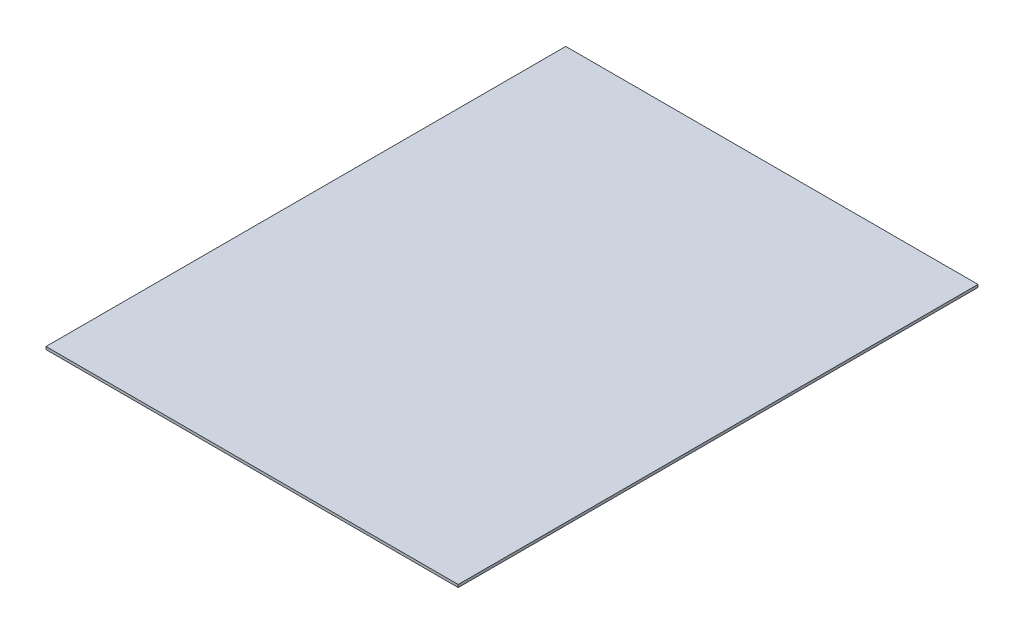
ISO-10303-21;
HEADER;
FILE_DESCRIPTION(('STEP AP214'),'2;1');
FILE_NAME('part.step','',(''),(''),'','','');
FILE_SCHEMA(('AUTOMOTIVE_DESIGN { 1 0 10303 214 1 1 1 1 }'));
ENDSEC;
DATA;
#1=APPLICATION_CONTEXT('core data for automotive mechanical design processes');
#2=APPLICATION_PROTOCOL_DEFINITION('international standard','automotive_design',2000,#1);
#3=PRODUCT_CONTEXT('',#1,'mechanical');
#4=PRODUCT('Part','Part','',(#3));
#5=PRODUCT_RELATED_PRODUCT_CATEGORY('part','',(#4));
#6=PRODUCT_DEFINITION_FORMATION('','',#4);
#7=PRODUCT_DEFINITION_CONTEXT('part definition',#1,'design');
#8=PRODUCT_DEFINITION('design','',#6,#7);
#9=PRODUCT_DEFINITION_SHAPE('','',#8);
#10=(LENGTH_UNIT() NAMED_UNIT(*) SI_UNIT(.MILLI.,.METRE.));
#11=(NAMED_UNIT(*) PLANE_ANGLE_UNIT() SI_UNIT($,.RADIAN.));
#12=(NAMED_UNIT(*) SI_UNIT($,.STERADIAN.) SOLID_ANGLE_UNIT());
#13=UNCERTAINTY_MEASURE_WITH_UNIT(LENGTH_MEASURE(1.E-05),#10,'distance_accuracy_value','');
#14=(GEOMETRIC_REPRESENTATION_CONTEXT(3) GLOBAL_UNCERTAINTY_ASSIGNED_CONTEXT((#13)) GLOBAL_UNIT_ASSIGNED_CONTEXT((#10,
#11,#12)) REPRESENTATION_CONTEXT('',''));
#15=CARTESIAN_POINT('',(0.,0.,0.));
#16=DIRECTION('',(0.,0.,1.));
#17=DIRECTION('',(1.,0.,0.));
#18=AXIS2_PLACEMENT_3D('',#15,#16,#17);
#19=CARTESIAN_POINT('',(230.,3.,-290.));
#20=DIRECTION('',(-1.,0.,0.));
#21=DIRECTION('',(0.,0.,1.));
#22=AXIS2_PLACEMENT_3D('',#19,#20,#21);
#23=PLANE('',#22);
#24=DIRECTION('',(0.,0.,-1.));
#25=VECTOR('',#24,1.);
#26=CARTESIAN_POINT('',(230.,0.,-290.));
#27=LINE('',#26,#25);
#28=CARTESIAN_POINT('',(230.,0.,290.));
#29=VERTEX_POINT('',#28);
#30=CARTESIAN_POINT('',(230.,0.,-290.));
#31=VERTEX_POINT('',#30);
#32=EDGE_CURVE('E102',#29,#31,#27,.T.);
#33=ORIENTED_EDGE('',*,*,#32,.T.);
#34=DIRECTION('',(0.,-1.,0.));
#35=VECTOR('',#34,1.);
#36=CARTESIAN_POINT('',(230.,3.,-290.));
#37=LINE('',#36,#35);
#38=CARTESIAN_POINT('',(230.,3.,-290.));
#39=VERTEX_POINT('',#38);
#40=EDGE_CURVE('E11',#39,#31,#37,.T.);
#41=ORIENTED_EDGE('',*,*,#40,.F.);
#42=DIRECTION('',(0.,0.,-1.));
#43=VECTOR('',#42,1.);
#44=CARTESIAN_POINT('',(230.,3.,-290.));
#45=LINE('',#44,#43);
#46=CARTESIAN_POINT('',(230.,3.,290.));
#47=VERTEX_POINT('',#46);
#48=EDGE_CURVE('E90',#47,#39,#45,.T.);
#49=ORIENTED_EDGE('',*,*,#48,.F.);
#50=DIRECTION('',(0.,-1.,0.));
#51=VECTOR('',#50,1.);
#52=CARTESIAN_POINT('',(230.,3.,290.));
#53=LINE('',#52,#51);
#54=EDGE_CURVE('E98',#47,#29,#53,.T.);
#55=ORIENTED_EDGE('',*,*,#54,.T.);
#56=EDGE_LOOP('',(#33,#41,#49,#55));
#57=FACE_BOUND('',#56,.T.);
#58=ADVANCED_FACE('F39',(#57),#23,.F.);
#59=CARTESIAN_POINT('',(-230.,3.,-290.));
#60=DIRECTION('',(0.,0.,1.));
#61=DIRECTION('',(1.,0.,0.));
#62=AXIS2_PLACEMENT_3D('',#59,#60,#61);
#63=PLANE('',#62);
#64=DIRECTION('',(-1.,0.,0.));
#65=VECTOR('',#64,1.);
#66=CARTESIAN_POINT('',(-230.,0.,-290.));
#67=LINE('',#66,#65);
#68=CARTESIAN_POINT('',(-230.,0.,-290.));
#69=VERTEX_POINT('',#68);
#70=EDGE_CURVE('E94',#31,#69,#67,.T.);
#71=ORIENTED_EDGE('',*,*,#70,.T.);
#72=DIRECTION('',(0.,-1.,0.));
#73=VECTOR('',#72,1.);
#74=CARTESIAN_POINT('',(-230.,3.,-290.));
#75=LINE('',#74,#73);
#76=CARTESIAN_POINT('',(-230.,3.,-290.));
#77=VERTEX_POINT('',#76);
#78=EDGE_CURVE('E47',#77,#69,#75,.T.);
#79=ORIENTED_EDGE('',*,*,#78,.F.);
#80=DIRECTION('',(-1.,0.,0.));
#81=VECTOR('',#80,1.);
#82=CARTESIAN_POINT('',(-230.,3.,-290.));
#83=LINE('',#82,#81);
#84=EDGE_CURVE('E85',#39,#77,#83,.T.);
#85=ORIENTED_EDGE('',*,*,#84,.F.);
#86=ORIENTED_EDGE('',*,*,#40,.T.);
#87=EDGE_LOOP('',(#71,#79,#85,#86));
#88=FACE_BOUND('',#87,.T.);
#89=ADVANCED_FACE('F93',(#88),#63,.F.);
#90=CARTESIAN_POINT('',(-230.,3.,-290.));
#91=DIRECTION('',(1.,0.,0.));
#92=DIRECTION('',(0.,0.,-1.));
#93=AXIS2_PLACEMENT_3D('',#90,#91,#92);
#94=PLANE('',#93);
#95=DIRECTION('',(0.,0.,1.));
#96=VECTOR('',#95,1.);
#97=CARTESIAN_POINT('',(-230.,0.,-290.));
#98=LINE('',#97,#96);
#99=CARTESIAN_POINT('',(-230.,0.,290.));
#100=VERTEX_POINT('',#99);
#101=EDGE_CURVE('E72',#69,#100,#98,.T.);
#102=ORIENTED_EDGE('',*,*,#101,.T.);
#103=DIRECTION('',(0.,-1.,0.));
#104=VECTOR('',#103,1.);
#105=CARTESIAN_POINT('',(-230.,3.,290.));
#106=LINE('',#105,#104);
#107=CARTESIAN_POINT('',(-230.,3.,290.));
#108=VERTEX_POINT('',#107);
#109=EDGE_CURVE('E95',#108,#100,#106,.T.);
#110=ORIENTED_EDGE('',*,*,#109,.F.);
#111=DIRECTION('',(0.,0.,1.));
#112=VECTOR('',#111,1.);
#113=CARTESIAN_POINT('',(-230.,3.,-290.));
#114=LINE('',#113,#112);
#115=EDGE_CURVE('E88',#77,#108,#114,.T.);
#116=ORIENTED_EDGE('',*,*,#115,.F.);
#117=ORIENTED_EDGE('',*,*,#78,.T.);
#118=EDGE_LOOP('',(#102,#110,#116,#117));
#119=FACE_BOUND('',#118,.T.);
#120=ADVANCED_FACE('F96',(#119),#94,.F.);
#121=CARTESIAN_POINT('',(-230.,3.,290.));
#122=DIRECTION('',(0.,0.,-1.));
#123=DIRECTION('',(-1.,0.,0.));
#124=AXIS2_PLACEMENT_3D('',#121,#122,#123);
#125=PLANE('',#124);
#126=DIRECTION('',(1.,0.,0.));
#127=VECTOR('',#126,1.);
#128=CARTESIAN_POINT('',(-230.,0.,290.));
#129=LINE('',#128,#127);
#130=EDGE_CURVE('E78',#100,#29,#129,.T.);
#131=ORIENTED_EDGE('',*,*,#130,.T.);
#132=ORIENTED_EDGE('',*,*,#54,.F.);
#133=DIRECTION('',(1.,0.,0.));
#134=VECTOR('',#133,1.);
#135=CARTESIAN_POINT('',(-230.,3.,290.));
#136=LINE('',#135,#134);
#137=EDGE_CURVE('E55',#108,#47,#136,.T.);
#138=ORIENTED_EDGE('',*,*,#137,.F.);
#139=ORIENTED_EDGE('',*,*,#109,.T.);
#140=EDGE_LOOP('',(#131,#132,#138,#139));
#141=FACE_BOUND('',#140,.T.);
#142=ADVANCED_FACE('F109',(#141),#125,.F.);
#143=CARTESIAN_POINT('',(0.,3.,0.));
#144=DIRECTION('',(0.,1.,0.));
#145=DIRECTION('',(0.,0.,1.));
#146=AXIS2_PLACEMENT_3D('',#143,#144,#145);
#147=PLANE('',#146);
#148=ORIENTED_EDGE('',*,*,#48,.T.);
#149=ORIENTED_EDGE('',*,*,#84,.T.);
#150=ORIENTED_EDGE('',*,*,#115,.T.);
#151=ORIENTED_EDGE('',*,*,#137,.T.);
#152=EDGE_LOOP('',(#148,#149,#150,#151));
#153=FACE_BOUND('',#152,.T.);
#154=ADVANCED_FACE('F86',(#153),#147,.T.);
#155=CARTESIAN_POINT('',(0.,0.,0.));
#156=DIRECTION('',(0.,1.,0.));
#157=DIRECTION('',(0.,0.,1.));
#158=AXIS2_PLACEMENT_3D('',#155,#156,#157);
#159=PLANE('',#158);
#160=ORIENTED_EDGE('',*,*,#32,.F.);
#161=ORIENTED_EDGE('',*,*,#130,.F.);
#162=ORIENTED_EDGE('',*,*,#101,.F.);
#163=ORIENTED_EDGE('',*,*,#70,.F.);
#164=EDGE_LOOP('',(#160,#161,#162,#163));
#165=FACE_BOUND('',#164,.T.);
#166=ADVANCED_FACE('F112',(#165),#159,.F.);
#167=CLOSED_SHELL('',(#58,#89,#120,#142,#154,#166));
#168=MANIFOLD_SOLID_BREP('B2',#167);
#169=ADVANCED_BREP_SHAPE_REPRESENTATION('',(#18,#168),#14);
#170=SHAPE_DEFINITION_REPRESENTATION(#9,#169);
ENDSEC;
END-ISO-10303-21;
